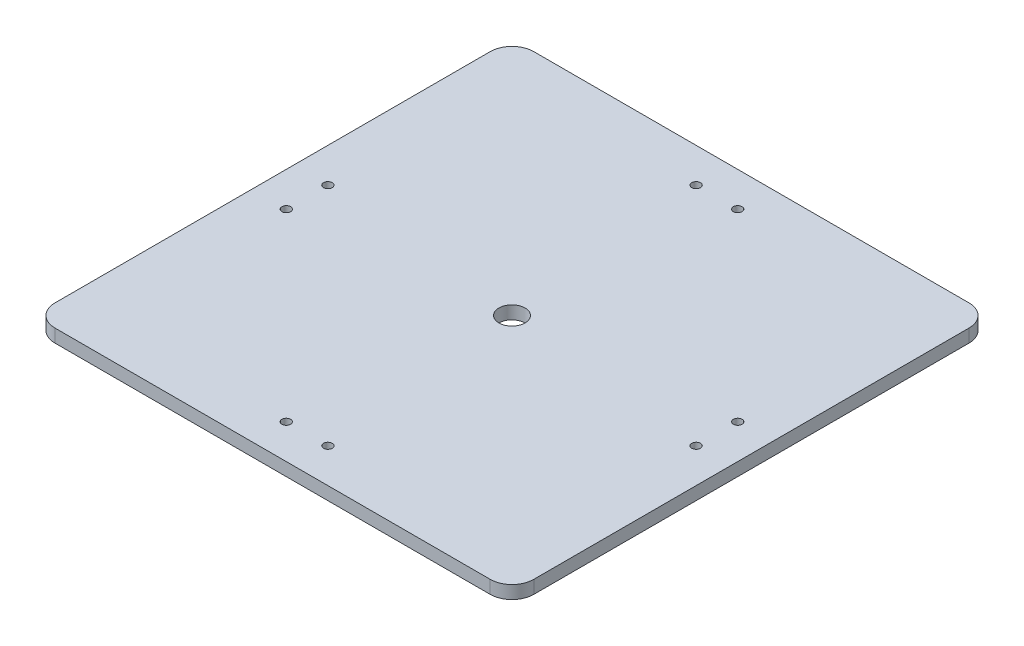
ISO-10303-21;
HEADER;
FILE_DESCRIPTION(('STEP AP214'),'2;1');
FILE_NAME('part.step','',(''),(''),'','','');
FILE_SCHEMA(('AUTOMOTIVE_DESIGN { 1 0 10303 214 1 1 1 1 }'));
ENDSEC;
DATA;
#1=APPLICATION_CONTEXT('core data for automotive mechanical design processes');
#2=APPLICATION_PROTOCOL_DEFINITION('international standard','automotive_design',2000,#1);
#3=PRODUCT_CONTEXT('',#1,'mechanical');
#4=PRODUCT('Part','Part','',(#3));
#5=PRODUCT_RELATED_PRODUCT_CATEGORY('part','',(#4));
#6=PRODUCT_DEFINITION_FORMATION('','',#4);
#7=PRODUCT_DEFINITION_CONTEXT('part definition',#1,'design');
#8=PRODUCT_DEFINITION('design','',#6,#7);
#9=PRODUCT_DEFINITION_SHAPE('','',#8);
#10=(LENGTH_UNIT() NAMED_UNIT(*) SI_UNIT(.MILLI.,.METRE.));
#11=(NAMED_UNIT(*) PLANE_ANGLE_UNIT() SI_UNIT($,.RADIAN.));
#12=(NAMED_UNIT(*) SI_UNIT($,.STERADIAN.) SOLID_ANGLE_UNIT());
#13=UNCERTAINTY_MEASURE_WITH_UNIT(LENGTH_MEASURE(1.E-05),#10,'distance_accuracy_value','');
#14=(GEOMETRIC_REPRESENTATION_CONTEXT(3) GLOBAL_UNCERTAINTY_ASSIGNED_CONTEXT((#13)) GLOBAL_UNIT_ASSIGNED_CONTEXT((#10,
#11,#12)) REPRESENTATION_CONTEXT('',''));
#15=CARTESIAN_POINT('',(0.,0.,0.));
#16=DIRECTION('',(0.,0.,1.));
#17=DIRECTION('',(1.,0.,0.));
#18=AXIS2_PLACEMENT_3D('',#15,#16,#17);
#19=CARTESIAN_POINT('',(-110.,6.,110.));
#20=DIRECTION('',(1.,0.,0.));
#21=DIRECTION('',(0.,0.,-1.));
#22=AXIS2_PLACEMENT_3D('',#19,#20,#21);
#23=PLANE('',#22);
#24=DIRECTION('',(0.,0.,1.));
#25=VECTOR('',#24,1.);
#26=CARTESIAN_POINT('',(-110.,6.,110.));
#27=LINE('',#26,#25);
#28=CARTESIAN_POINT('',(-110.,6.,-100.));
#29=VERTEX_POINT('',#28);
#30=CARTESIAN_POINT('',(-110.,6.,100.));
#31=VERTEX_POINT('',#30);
#32=EDGE_CURVE('E117',#29,#31,#27,.T.);
#33=ORIENTED_EDGE('',*,*,#32,.F.);
#34=DIRECTION('',(0.,-1.,0.));
#35=VECTOR('',#34,1.);
#36=CARTESIAN_POINT('',(-110.,6.,-100.));
#37=LINE('',#36,#35);
#38=CARTESIAN_POINT('',(-110.,0.,-100.));
#39=VERTEX_POINT('',#38);
#40=EDGE_CURVE('E102',#29,#39,#37,.T.);
#41=ORIENTED_EDGE('',*,*,#40,.T.);
#42=DIRECTION('',(0.,0.,1.));
#43=VECTOR('',#42,1.);
#44=CARTESIAN_POINT('',(-110.,0.,110.));
#45=LINE('',#44,#43);
#46=CARTESIAN_POINT('',(-110.,0.,100.));
#47=VERTEX_POINT('',#46);
#48=EDGE_CURVE('E114',#39,#47,#45,.T.);
#49=ORIENTED_EDGE('',*,*,#48,.T.);
#50=DIRECTION('',(0.,-1.,0.));
#51=VECTOR('',#50,1.);
#52=CARTESIAN_POINT('',(-110.,6.,100.));
#53=LINE('',#52,#51);
#54=EDGE_CURVE('E119',#47,#31,#53,.F.);
#55=ORIENTED_EDGE('',*,*,#54,.T.);
#56=EDGE_LOOP('',(#33,#41,#49,#55));
#57=FACE_BOUND('',#56,.T.);
#58=ADVANCED_FACE('F33',(#57),#23,.F.);
#59=CARTESIAN_POINT('',(110.,6.,110.));
#60=DIRECTION('',(0.,0.,-1.));
#61=DIRECTION('',(-1.,0.,0.));
#62=AXIS2_PLACEMENT_3D('',#59,#60,#61);
#63=PLANE('',#62);
#64=DIRECTION('',(1.,0.,0.));
#65=VECTOR('',#64,1.);
#66=CARTESIAN_POINT('',(110.,6.,110.));
#67=LINE('',#66,#65);
#68=CARTESIAN_POINT('',(-100.,6.,110.));
#69=VERTEX_POINT('',#68);
#70=CARTESIAN_POINT('',(100.,6.,110.));
#71=VERTEX_POINT('',#70);
#72=EDGE_CURVE('E172',#69,#71,#67,.T.);
#73=ORIENTED_EDGE('',*,*,#72,.F.);
#74=DIRECTION('',(0.,-1.,0.));
#75=VECTOR('',#74,1.);
#76=CARTESIAN_POINT('',(-100.,6.,110.));
#77=LINE('',#76,#75);
#78=CARTESIAN_POINT('',(-100.,0.,110.));
#79=VERTEX_POINT('',#78);
#80=EDGE_CURVE('E156',#69,#79,#77,.T.);
#81=ORIENTED_EDGE('',*,*,#80,.T.);
#82=DIRECTION('',(1.,0.,0.));
#83=VECTOR('',#82,1.);
#84=CARTESIAN_POINT('',(110.,0.,110.));
#85=LINE('',#84,#83);
#86=CARTESIAN_POINT('',(100.,0.,110.));
#87=VERTEX_POINT('',#86);
#88=EDGE_CURVE('E123',#79,#87,#85,.T.);
#89=ORIENTED_EDGE('',*,*,#88,.T.);
#90=DIRECTION('',(0.,-1.,0.));
#91=VECTOR('',#90,1.);
#92=CARTESIAN_POINT('',(100.,6.,110.));
#93=LINE('',#92,#91);
#94=EDGE_CURVE('E154',#87,#71,#93,.F.);
#95=ORIENTED_EDGE('',*,*,#94,.T.);
#96=EDGE_LOOP('',(#73,#81,#89,#95));
#97=FACE_BOUND('',#96,.T.);
#98=ADVANCED_FACE('F265',(#97),#63,.F.);
#99=CARTESIAN_POINT('',(110.,6.,110.));
#100=DIRECTION('',(-1.,0.,0.));
#101=DIRECTION('',(0.,0.,1.));
#102=AXIS2_PLACEMENT_3D('',#99,#100,#101);
#103=PLANE('',#102);
#104=DIRECTION('',(0.,0.,-1.));
#105=VECTOR('',#104,1.);
#106=CARTESIAN_POINT('',(110.,0.,110.));
#107=LINE('',#106,#105);
#108=CARTESIAN_POINT('',(110.,0.,100.));
#109=VERTEX_POINT('',#108);
#110=CARTESIAN_POINT('',(110.,0.,-100.));
#111=VERTEX_POINT('',#110);
#112=EDGE_CURVE('E127',#109,#111,#107,.T.);
#113=ORIENTED_EDGE('',*,*,#112,.T.);
#114=DIRECTION('',(0.,-1.,0.));
#115=VECTOR('',#114,1.);
#116=CARTESIAN_POINT('',(110.,6.,-100.));
#117=LINE('',#116,#115);
#118=CARTESIAN_POINT('',(110.,6.,-100.));
#119=VERTEX_POINT('',#118);
#120=EDGE_CURVE('E11',#111,#119,#117,.F.);
#121=ORIENTED_EDGE('',*,*,#120,.T.);
#122=DIRECTION('',(0.,0.,-1.));
#123=VECTOR('',#122,1.);
#124=CARTESIAN_POINT('',(110.,6.,110.));
#125=LINE('',#124,#123);
#126=CARTESIAN_POINT('',(110.,6.,100.));
#127=VERTEX_POINT('',#126);
#128=EDGE_CURVE('E162',#127,#119,#125,.T.);
#129=ORIENTED_EDGE('',*,*,#128,.F.);
#130=DIRECTION('',(0.,-1.,0.));
#131=VECTOR('',#130,1.);
#132=CARTESIAN_POINT('',(110.,6.,100.));
#133=LINE('',#132,#131);
#134=EDGE_CURVE('E41',#127,#109,#133,.T.);
#135=ORIENTED_EDGE('',*,*,#134,.T.);
#136=EDGE_LOOP('',(#113,#121,#129,#135));
#137=FACE_BOUND('',#136,.T.);
#138=ADVANCED_FACE('F161',(#137),#103,.F.);
#139=CARTESIAN_POINT('',(110.,6.,-110.));
#140=DIRECTION('',(0.,0.,1.));
#141=DIRECTION('',(1.,0.,0.));
#142=AXIS2_PLACEMENT_3D('',#139,#140,#141);
#143=PLANE('',#142);
#144=DIRECTION('',(-1.,0.,0.));
#145=VECTOR('',#144,1.);
#146=CARTESIAN_POINT('',(110.,0.,-110.));
#147=LINE('',#146,#145);
#148=CARTESIAN_POINT('',(100.,0.,-110.));
#149=VERTEX_POINT('',#148);
#150=CARTESIAN_POINT('',(-100.,0.,-110.));
#151=VERTEX_POINT('',#150);
#152=EDGE_CURVE('E137',#149,#151,#147,.T.);
#153=ORIENTED_EDGE('',*,*,#152,.T.);
#154=DIRECTION('',(0.,-1.,0.));
#155=VECTOR('',#154,1.);
#156=CARTESIAN_POINT('',(-100.,6.,-110.));
#157=LINE('',#156,#155);
#158=CARTESIAN_POINT('',(-100.,6.,-110.));
#159=VERTEX_POINT('',#158);
#160=EDGE_CURVE('E103',#151,#159,#157,.F.);
#161=ORIENTED_EDGE('',*,*,#160,.T.);
#162=DIRECTION('',(-1.,0.,0.));
#163=VECTOR('',#162,1.);
#164=CARTESIAN_POINT('',(110.,6.,-110.));
#165=LINE('',#164,#163);
#166=CARTESIAN_POINT('',(100.,6.,-110.));
#167=VERTEX_POINT('',#166);
#168=EDGE_CURVE('E133',#167,#159,#165,.T.);
#169=ORIENTED_EDGE('',*,*,#168,.F.);
#170=DIRECTION('',(0.,-1.,0.));
#171=VECTOR('',#170,1.);
#172=CARTESIAN_POINT('',(100.,6.,-110.));
#173=LINE('',#172,#171);
#174=EDGE_CURVE('E108',#167,#149,#173,.T.);
#175=ORIENTED_EDGE('',*,*,#174,.T.);
#176=EDGE_LOOP('',(#153,#161,#169,#175));
#177=FACE_BOUND('',#176,.T.);
#178=ADVANCED_FACE('F170',(#177),#143,.F.);
#179=CARTESIAN_POINT('',(0.,6.,0.));
#180=DIRECTION('',(0.,1.,0.));
#181=DIRECTION('',(0.,0.,1.));
#182=AXIS2_PLACEMENT_3D('',#179,#180,#181);
#183=PLANE('',#182);
#184=CARTESIAN_POINT('',(-9.557884959055,6.,94.1527377769062));
#185=DIRECTION('',(0.,1.,0.));
#186=DIRECTION('',(0.,0.,1.));
#187=AXIS2_PLACEMENT_3D('',#184,#185,#186);
#188=CIRCLE('',#187,2.);
#189=CARTESIAN_POINT('',(-9.557884959055,6.,96.1527377769062));
#190=VERTEX_POINT('',#189);
#191=EDGE_CURVE('E223',#190,#190,#188,.T.);
#192=ORIENTED_EDGE('',*,*,#191,.F.);
#193=EDGE_LOOP('',(#192));
#194=FACE_BOUND('',#193,.T.);
#195=CARTESIAN_POINT('',(9.5578849590553,6.,94.1527377769062));
#196=DIRECTION('',(0.,1.,0.));
#197=DIRECTION('',(0.,0.,1.));
#198=AXIS2_PLACEMENT_3D('',#195,#196,#197);
#199=CIRCLE('',#198,2.);
#200=CARTESIAN_POINT('',(9.5578849590553,6.,96.1527377769062));
#201=VERTEX_POINT('',#200);
#202=EDGE_CURVE('E217',#201,#201,#199,.T.);
#203=ORIENTED_EDGE('',*,*,#202,.F.);
#204=EDGE_LOOP('',(#203));
#205=FACE_BOUND('',#204,.T.);
#206=CARTESIAN_POINT('',(94.1527377769062,6.,9.55788495905531));
#207=DIRECTION('',(0.,1.,0.));
#208=DIRECTION('',(0.,0.,1.));
#209=AXIS2_PLACEMENT_3D('',#206,#207,#208);
#210=CIRCLE('',#209,2.);
#211=CARTESIAN_POINT('',(94.1527377769062,6.,11.5578849590553));
#212=VERTEX_POINT('',#211);
#213=EDGE_CURVE('E211',#212,#212,#210,.T.);
#214=ORIENTED_EDGE('',*,*,#213,.F.);
#215=EDGE_LOOP('',(#214));
#216=FACE_BOUND('',#215,.T.);
#217=CARTESIAN_POINT('',(94.1527377769062,6.,-9.55788495905629));
#218=DIRECTION('',(0.,1.,0.));
#219=DIRECTION('',(0.,0.,1.));
#220=AXIS2_PLACEMENT_3D('',#217,#218,#219);
#221=CIRCLE('',#220,2.);
#222=CARTESIAN_POINT('',(94.1527377769062,6.,-7.55788495905629));
#223=VERTEX_POINT('',#222);
#224=EDGE_CURVE('E205',#223,#223,#221,.T.);
#225=ORIENTED_EDGE('',*,*,#224,.F.);
#226=EDGE_LOOP('',(#225));
#227=FACE_BOUND('',#226,.T.);
#228=CARTESIAN_POINT('',(9.55788495905436,6.,-94.1527377769063));
#229=DIRECTION('',(0.,1.,0.));
#230=DIRECTION('',(0.,0.,1.));
#231=AXIS2_PLACEMENT_3D('',#228,#229,#230);
#232=CIRCLE('',#231,2.);
#233=CARTESIAN_POINT('',(9.55788495905436,6.,-92.1527377769063));
#234=VERTEX_POINT('',#233);
#235=EDGE_CURVE('E199',#234,#234,#232,.T.);
#236=ORIENTED_EDGE('',*,*,#235,.F.);
#237=EDGE_LOOP('',(#236));
#238=FACE_BOUND('',#237,.T.);
#239=CARTESIAN_POINT('',(-9.55788495905526,6.,-94.1527377769063));
#240=DIRECTION('',(0.,1.,0.));
#241=DIRECTION('',(0.,0.,1.));
#242=AXIS2_PLACEMENT_3D('',#239,#240,#241);
#243=CIRCLE('',#242,2.);
#244=CARTESIAN_POINT('',(-9.55788495905526,6.,-92.1527377769063));
#245=VERTEX_POINT('',#244);
#246=EDGE_CURVE('E193',#245,#245,#243,.T.);
#247=ORIENTED_EDGE('',*,*,#246,.F.);
#248=EDGE_LOOP('',(#247));
#249=FACE_BOUND('',#248,.T.);
#250=CARTESIAN_POINT('',(-94.1527377769062,6.,-9.55788495905534));
#251=DIRECTION('',(0.,1.,0.));
#252=DIRECTION('',(0.,0.,1.));
#253=AXIS2_PLACEMENT_3D('',#250,#251,#252);
#254=CIRCLE('',#253,2.);
#255=CARTESIAN_POINT('',(-94.1527377769062,6.,-7.55788495905534));
#256=VERTEX_POINT('',#255);
#257=EDGE_CURVE('E187',#256,#256,#254,.T.);
#258=ORIENTED_EDGE('',*,*,#257,.F.);
#259=EDGE_LOOP('',(#258));
#260=FACE_BOUND('',#259,.T.);
#261=CARTESIAN_POINT('',(-94.1527377769062,6.,9.55788495905561));
#262=DIRECTION('',(0.,1.,0.));
#263=DIRECTION('',(0.,0.,1.));
#264=AXIS2_PLACEMENT_3D('',#261,#262,#263);
#265=CIRCLE('',#264,2.);
#266=CARTESIAN_POINT('',(-94.1527377769062,6.,11.5578849590556));
#267=VERTEX_POINT('',#266);
#268=EDGE_CURVE('E181',#267,#267,#265,.T.);
#269=ORIENTED_EDGE('',*,*,#268,.F.);
#270=EDGE_LOOP('',(#269));
#271=FACE_BOUND('',#270,.T.);
#272=CARTESIAN_POINT('',(0.,6.,0.));
#273=DIRECTION('',(0.,1.,0.));
#274=DIRECTION('',(0.,0.,1.));
#275=AXIS2_PLACEMENT_3D('',#272,#273,#274);
#276=CIRCLE('',#275,6.);
#277=CARTESIAN_POINT('',(0.,6.,6.));
#278=VERTEX_POINT('',#277);
#279=EDGE_CURVE('E130',#278,#278,#276,.T.);
#280=ORIENTED_EDGE('',*,*,#279,.F.);
#281=EDGE_LOOP('',(#280));
#282=FACE_BOUND('',#281,.T.);
#283=ORIENTED_EDGE('',*,*,#168,.T.);
#284=CARTESIAN_POINT('',(-100.,6.,-100.));
#285=DIRECTION('',(0.,1.,0.));
#286=DIRECTION('',(0.,0.,1.));
#287=AXIS2_PLACEMENT_3D('',#284,#285,#286);
#288=CIRCLE('',#287,10.);
#289=EDGE_CURVE('E152',#159,#29,#288,.T.);
#290=ORIENTED_EDGE('',*,*,#289,.T.);
#291=ORIENTED_EDGE('',*,*,#32,.T.);
#292=CARTESIAN_POINT('',(-100.,6.,100.));
#293=DIRECTION('',(0.,1.,0.));
#294=DIRECTION('',(0.,0.,1.));
#295=AXIS2_PLACEMENT_3D('',#292,#293,#294);
#296=CIRCLE('',#295,10.);
#297=EDGE_CURVE('E150',#31,#69,#296,.T.);
#298=ORIENTED_EDGE('',*,*,#297,.T.);
#299=ORIENTED_EDGE('',*,*,#72,.T.);
#300=CARTESIAN_POINT('',(100.,6.,100.));
#301=DIRECTION('',(0.,1.,0.));
#302=DIRECTION('',(0.,0.,1.));
#303=AXIS2_PLACEMENT_3D('',#300,#301,#302);
#304=CIRCLE('',#303,10.);
#305=EDGE_CURVE('E53',#71,#127,#304,.T.);
#306=ORIENTED_EDGE('',*,*,#305,.T.);
#307=ORIENTED_EDGE('',*,*,#128,.T.);
#308=CARTESIAN_POINT('',(100.,6.,-100.));
#309=DIRECTION('',(0.,1.,0.));
#310=DIRECTION('',(0.,0.,1.));
#311=AXIS2_PLACEMENT_3D('',#308,#309,#310);
#312=CIRCLE('',#311,10.);
#313=EDGE_CURVE('E148',#119,#167,#312,.T.);
#314=ORIENTED_EDGE('',*,*,#313,.T.);
#315=EDGE_LOOP('',(#283,#290,#291,#298,#299,#306,#307,#314));
#316=FACE_BOUND('',#315,.T.);
#317=ADVANCED_FACE('F230',(#194,#205,#216,#227,#238,#249,#260,#271,#282,#316),#183,.T.);
#318=CARTESIAN_POINT('',(0.,0.,0.));
#319=DIRECTION('',(0.,1.,0.));
#320=DIRECTION('',(0.,0.,1.));
#321=AXIS2_PLACEMENT_3D('',#318,#319,#320);
#322=PLANE('',#321);
#323=CARTESIAN_POINT('',(-9.557884959055,0.,94.1527377769062));
#324=DIRECTION('',(0.,1.,0.));
#325=DIRECTION('',(0.,0.,1.));
#326=AXIS2_PLACEMENT_3D('',#323,#324,#325);
#327=CIRCLE('',#326,2.);
#328=CARTESIAN_POINT('',(-9.557884959055,0.,96.1527377769062));
#329=VERTEX_POINT('',#328);
#330=EDGE_CURVE('E220',#329,#329,#327,.T.);
#331=ORIENTED_EDGE('',*,*,#330,.T.);
#332=EDGE_LOOP('',(#331));
#333=FACE_BOUND('',#332,.T.);
#334=CARTESIAN_POINT('',(9.5578849590553,0.,94.1527377769062));
#335=DIRECTION('',(0.,1.,0.));
#336=DIRECTION('',(0.,0.,1.));
#337=AXIS2_PLACEMENT_3D('',#334,#335,#336);
#338=CIRCLE('',#337,1.99999999999999);
#339=CARTESIAN_POINT('',(9.5578849590553,0.,96.1527377769062));
#340=VERTEX_POINT('',#339);
#341=EDGE_CURVE('E214',#340,#340,#338,.T.);
#342=ORIENTED_EDGE('',*,*,#341,.T.);
#343=EDGE_LOOP('',(#342));
#344=FACE_BOUND('',#343,.T.);
#345=CARTESIAN_POINT('',(94.1527377769062,0.,9.55788495905531));
#346=DIRECTION('',(0.,1.,0.));
#347=DIRECTION('',(0.,0.,1.));
#348=AXIS2_PLACEMENT_3D('',#345,#346,#347);
#349=CIRCLE('',#348,1.99999999999999);
#350=CARTESIAN_POINT('',(94.1527377769062,0.,11.5578849590553));
#351=VERTEX_POINT('',#350);
#352=EDGE_CURVE('E208',#351,#351,#349,.T.);
#353=ORIENTED_EDGE('',*,*,#352,.T.);
#354=EDGE_LOOP('',(#353));
#355=FACE_BOUND('',#354,.T.);
#356=CARTESIAN_POINT('',(94.1527377769062,0.,-9.55788495905629));
#357=DIRECTION('',(0.,1.,0.));
#358=DIRECTION('',(0.,0.,1.));
#359=AXIS2_PLACEMENT_3D('',#356,#357,#358);
#360=CIRCLE('',#359,1.99999999999999);
#361=CARTESIAN_POINT('',(94.1527377769062,0.,-7.5578849590563));
#362=VERTEX_POINT('',#361);
#363=EDGE_CURVE('E202',#362,#362,#360,.T.);
#364=ORIENTED_EDGE('',*,*,#363,.T.);
#365=EDGE_LOOP('',(#364));
#366=FACE_BOUND('',#365,.T.);
#367=CARTESIAN_POINT('',(9.55788495905436,0.,-94.1527377769063));
#368=DIRECTION('',(0.,1.,0.));
#369=DIRECTION('',(0.,0.,1.));
#370=AXIS2_PLACEMENT_3D('',#367,#368,#369);
#371=CIRCLE('',#370,1.99999999999999);
#372=CARTESIAN_POINT('',(9.55788495905436,0.,-92.1527377769063));
#373=VERTEX_POINT('',#372);
#374=EDGE_CURVE('E196',#373,#373,#371,.T.);
#375=ORIENTED_EDGE('',*,*,#374,.T.);
#376=EDGE_LOOP('',(#375));
#377=FACE_BOUND('',#376,.T.);
#378=CARTESIAN_POINT('',(-9.55788495905526,0.,-94.1527377769063));
#379=DIRECTION('',(0.,1.,0.));
#380=DIRECTION('',(0.,0.,1.));
#381=AXIS2_PLACEMENT_3D('',#378,#379,#380);
#382=CIRCLE('',#381,2.);
#383=CARTESIAN_POINT('',(-9.55788495905526,0.,-92.1527377769063));
#384=VERTEX_POINT('',#383);
#385=EDGE_CURVE('E190',#384,#384,#382,.T.);
#386=ORIENTED_EDGE('',*,*,#385,.T.);
#387=EDGE_LOOP('',(#386));
#388=FACE_BOUND('',#387,.T.);
#389=CARTESIAN_POINT('',(-94.1527377769062,0.,-9.55788495905534));
#390=DIRECTION('',(0.,1.,0.));
#391=DIRECTION('',(0.,0.,1.));
#392=AXIS2_PLACEMENT_3D('',#389,#390,#391);
#393=CIRCLE('',#392,1.99999999999999);
#394=CARTESIAN_POINT('',(-94.1527377769062,0.,-7.55788495905534));
#395=VERTEX_POINT('',#394);
#396=EDGE_CURVE('E184',#395,#395,#393,.T.);
#397=ORIENTED_EDGE('',*,*,#396,.T.);
#398=EDGE_LOOP('',(#397));
#399=FACE_BOUND('',#398,.T.);
#400=CARTESIAN_POINT('',(-94.1527377769062,0.,9.55788495905561));
#401=DIRECTION('',(0.,1.,0.));
#402=DIRECTION('',(0.,0.,1.));
#403=AXIS2_PLACEMENT_3D('',#400,#401,#402);
#404=CIRCLE('',#403,1.99999999999999);
#405=CARTESIAN_POINT('',(-94.1527377769062,0.,11.5578849590556));
#406=VERTEX_POINT('',#405);
#407=EDGE_CURVE('E178',#406,#406,#404,.T.);
#408=ORIENTED_EDGE('',*,*,#407,.T.);
#409=EDGE_LOOP('',(#408));
#410=FACE_BOUND('',#409,.T.);
#411=CARTESIAN_POINT('',(0.,0.,0.));
#412=DIRECTION('',(0.,1.,0.));
#413=DIRECTION('',(0.,0.,1.));
#414=AXIS2_PLACEMENT_3D('',#411,#412,#413);
#415=CIRCLE('',#414,6.);
#416=CARTESIAN_POINT('',(0.,0.,6.));
#417=VERTEX_POINT('',#416);
#418=EDGE_CURVE('E124',#417,#417,#415,.T.);
#419=ORIENTED_EDGE('',*,*,#418,.T.);
#420=EDGE_LOOP('',(#419));
#421=FACE_BOUND('',#420,.T.);
#422=ORIENTED_EDGE('',*,*,#48,.F.);
#423=CARTESIAN_POINT('',(-100.,0.,-100.));
#424=DIRECTION('',(0.,1.,0.));
#425=DIRECTION('',(0.,0.,1.));
#426=AXIS2_PLACEMENT_3D('',#423,#424,#425);
#427=CIRCLE('',#426,10.);
#428=EDGE_CURVE('E98',#39,#151,#427,.F.);
#429=ORIENTED_EDGE('',*,*,#428,.T.);
#430=ORIENTED_EDGE('',*,*,#152,.F.);
#431=CARTESIAN_POINT('',(100.,0.,-100.));
#432=DIRECTION('',(0.,1.,0.));
#433=DIRECTION('',(0.,0.,1.));
#434=AXIS2_PLACEMENT_3D('',#431,#432,#433);
#435=CIRCLE('',#434,10.);
#436=EDGE_CURVE('E141',#149,#111,#435,.F.);
#437=ORIENTED_EDGE('',*,*,#436,.T.);
#438=ORIENTED_EDGE('',*,*,#112,.F.);
#439=CARTESIAN_POINT('',(100.,0.,100.));
#440=DIRECTION('',(0.,1.,0.));
#441=DIRECTION('',(0.,0.,1.));
#442=AXIS2_PLACEMENT_3D('',#439,#440,#441);
#443=CIRCLE('',#442,10.);
#444=EDGE_CURVE('E118',#109,#87,#443,.F.);
#445=ORIENTED_EDGE('',*,*,#444,.T.);
#446=ORIENTED_EDGE('',*,*,#88,.F.);
#447=CARTESIAN_POINT('',(-100.,0.,100.));
#448=DIRECTION('',(0.,1.,0.));
#449=DIRECTION('',(0.,0.,1.));
#450=AXIS2_PLACEMENT_3D('',#447,#448,#449);
#451=CIRCLE('',#450,10.);
#452=EDGE_CURVE('E109',#79,#47,#451,.F.);
#453=ORIENTED_EDGE('',*,*,#452,.T.);
#454=EDGE_LOOP('',(#422,#429,#430,#437,#438,#445,#446,#453));
#455=FACE_BOUND('',#454,.T.);
#456=ADVANCED_FACE('F121',(#333,#344,#355,#366,#377,#388,#399,#410,#421,#455),#322,.F.);
#457=CARTESIAN_POINT('',(0.,-45.,0.));
#458=DIRECTION('',(0.,1.,0.));
#459=DIRECTION('',(0.,0.,1.));
#460=AXIS2_PLACEMENT_3D('',#457,#458,#459);
#461=CYLINDRICAL_SURFACE('',#460,6.);
#462=ORIENTED_EDGE('',*,*,#279,.T.);
#463=EDGE_LOOP('',(#462));
#464=FACE_BOUND('',#463,.T.);
#465=ORIENTED_EDGE('',*,*,#418,.F.);
#466=EDGE_LOOP('',(#465));
#467=FACE_BOUND('',#466,.T.);
#468=ADVANCED_FACE('F250',(#464,#467),#461,.F.);
#469=CARTESIAN_POINT('',(-100.,6.,-100.));
#470=DIRECTION('',(0.,-1.,0.));
#471=DIRECTION('',(0.,0.,-1.));
#472=AXIS2_PLACEMENT_3D('',#469,#470,#471);
#473=CYLINDRICAL_SURFACE('',#472,10.);
#474=ORIENTED_EDGE('',*,*,#289,.F.);
#475=ORIENTED_EDGE('',*,*,#160,.F.);
#476=ORIENTED_EDGE('',*,*,#428,.F.);
#477=ORIENTED_EDGE('',*,*,#40,.F.);
#478=EDGE_LOOP('',(#474,#475,#476,#477));
#479=FACE_BOUND('',#478,.T.);
#480=ADVANCED_FACE('F101',(#479),#473,.T.);
#481=CARTESIAN_POINT('',(-100.,6.,100.));
#482=DIRECTION('',(0.,-1.,0.));
#483=DIRECTION('',(0.,0.,-1.));
#484=AXIS2_PLACEMENT_3D('',#481,#482,#483);
#485=CYLINDRICAL_SURFACE('',#484,10.);
#486=ORIENTED_EDGE('',*,*,#297,.F.);
#487=ORIENTED_EDGE('',*,*,#54,.F.);
#488=ORIENTED_EDGE('',*,*,#452,.F.);
#489=ORIENTED_EDGE('',*,*,#80,.F.);
#490=EDGE_LOOP('',(#486,#487,#488,#489));
#491=FACE_BOUND('',#490,.T.);
#492=ADVANCED_FACE('F277',(#491),#485,.T.);
#493=CARTESIAN_POINT('',(100.,6.,-100.));
#494=DIRECTION('',(0.,-1.,0.));
#495=DIRECTION('',(0.,0.,-1.));
#496=AXIS2_PLACEMENT_3D('',#493,#494,#495);
#497=CYLINDRICAL_SURFACE('',#496,10.);
#498=ORIENTED_EDGE('',*,*,#313,.F.);
#499=ORIENTED_EDGE('',*,*,#120,.F.);
#500=ORIENTED_EDGE('',*,*,#436,.F.);
#501=ORIENTED_EDGE('',*,*,#174,.F.);
#502=EDGE_LOOP('',(#498,#499,#500,#501));
#503=FACE_BOUND('',#502,.T.);
#504=ADVANCED_FACE('F167',(#503),#497,.T.);
#505=CARTESIAN_POINT('',(100.,6.,100.));
#506=DIRECTION('',(0.,-1.,0.));
#507=DIRECTION('',(0.,0.,-1.));
#508=AXIS2_PLACEMENT_3D('',#505,#506,#507);
#509=CYLINDRICAL_SURFACE('',#508,10.);
#510=ORIENTED_EDGE('',*,*,#305,.F.);
#511=ORIENTED_EDGE('',*,*,#94,.F.);
#512=ORIENTED_EDGE('',*,*,#444,.F.);
#513=ORIENTED_EDGE('',*,*,#134,.F.);
#514=EDGE_LOOP('',(#510,#511,#512,#513));
#515=FACE_BOUND('',#514,.T.);
#516=ADVANCED_FACE('F35',(#515),#509,.T.);
#517=CARTESIAN_POINT('',(-94.1527377769062,6.,9.55788495905561));
#518=DIRECTION('',(0.,1.,0.));
#519=DIRECTION('',(0.,0.,1.));
#520=AXIS2_PLACEMENT_3D('',#517,#518,#519);
#521=CYLINDRICAL_SURFACE('',#520,1.99999999999999);
#522=ORIENTED_EDGE('',*,*,#268,.T.);
#523=EDGE_LOOP('',(#522));
#524=FACE_BOUND('',#523,.T.);
#525=ORIENTED_EDGE('',*,*,#407,.F.);
#526=EDGE_LOOP('',(#525));
#527=FACE_BOUND('',#526,.T.);
#528=ADVANCED_FACE('F284',(#524,#527),#521,.F.);
#529=CARTESIAN_POINT('',(-94.1527377769062,6.,-9.55788495905534));
#530=DIRECTION('',(0.,1.,0.));
#531=DIRECTION('',(0.,0.,1.));
#532=AXIS2_PLACEMENT_3D('',#529,#530,#531);
#533=CYLINDRICAL_SURFACE('',#532,1.99999999999999);
#534=ORIENTED_EDGE('',*,*,#257,.T.);
#535=EDGE_LOOP('',(#534));
#536=FACE_BOUND('',#535,.T.);
#537=ORIENTED_EDGE('',*,*,#396,.F.);
#538=EDGE_LOOP('',(#537));
#539=FACE_BOUND('',#538,.T.);
#540=ADVANCED_FACE('F288',(#536,#539),#533,.F.);
#541=CARTESIAN_POINT('',(-9.55788495905526,6.,-94.1527377769063));
#542=DIRECTION('',(0.,1.,0.));
#543=DIRECTION('',(0.,0.,1.));
#544=AXIS2_PLACEMENT_3D('',#541,#542,#543);
#545=CYLINDRICAL_SURFACE('',#544,2.);
#546=ORIENTED_EDGE('',*,*,#246,.T.);
#547=EDGE_LOOP('',(#546));
#548=FACE_BOUND('',#547,.T.);
#549=ORIENTED_EDGE('',*,*,#385,.F.);
#550=EDGE_LOOP('',(#549));
#551=FACE_BOUND('',#550,.T.);
#552=ADVANCED_FACE('F297',(#548,#551),#545,.F.);
#553=CARTESIAN_POINT('',(9.55788495905436,6.,-94.1527377769063));
#554=DIRECTION('',(0.,1.,0.));
#555=DIRECTION('',(0.,0.,1.));
#556=AXIS2_PLACEMENT_3D('',#553,#554,#555);
#557=CYLINDRICAL_SURFACE('',#556,1.99999999999999);
#558=ORIENTED_EDGE('',*,*,#235,.T.);
#559=EDGE_LOOP('',(#558));
#560=FACE_BOUND('',#559,.T.);
#561=ORIENTED_EDGE('',*,*,#374,.F.);
#562=EDGE_LOOP('',(#561));
#563=FACE_BOUND('',#562,.T.);
#564=ADVANCED_FACE('F304',(#560,#563),#557,.F.);
#565=CARTESIAN_POINT('',(94.1527377769062,6.,-9.55788495905629));
#566=DIRECTION('',(0.,1.,0.));
#567=DIRECTION('',(0.,0.,1.));
#568=AXIS2_PLACEMENT_3D('',#565,#566,#567);
#569=CYLINDRICAL_SURFACE('',#568,1.99999999999999);
#570=ORIENTED_EDGE('',*,*,#224,.T.);
#571=EDGE_LOOP('',(#570));
#572=FACE_BOUND('',#571,.T.);
#573=ORIENTED_EDGE('',*,*,#363,.F.);
#574=EDGE_LOOP('',(#573));
#575=FACE_BOUND('',#574,.T.);
#576=ADVANCED_FACE('F308',(#572,#575),#569,.F.);
#577=CARTESIAN_POINT('',(94.1527377769062,6.,9.55788495905531));
#578=DIRECTION('',(0.,1.,0.));
#579=DIRECTION('',(0.,0.,1.));
#580=AXIS2_PLACEMENT_3D('',#577,#578,#579);
#581=CYLINDRICAL_SURFACE('',#580,1.99999999999999);
#582=ORIENTED_EDGE('',*,*,#213,.T.);
#583=EDGE_LOOP('',(#582));
#584=FACE_BOUND('',#583,.T.);
#585=ORIENTED_EDGE('',*,*,#352,.F.);
#586=EDGE_LOOP('',(#585));
#587=FACE_BOUND('',#586,.T.);
#588=ADVANCED_FACE('F312',(#584,#587),#581,.F.);
#589=CARTESIAN_POINT('',(9.5578849590553,6.,94.1527377769062));
#590=DIRECTION('',(0.,1.,0.));
#591=DIRECTION('',(0.,0.,1.));
#592=AXIS2_PLACEMENT_3D('',#589,#590,#591);
#593=CYLINDRICAL_SURFACE('',#592,1.99999999999999);
#594=ORIENTED_EDGE('',*,*,#202,.T.);
#595=EDGE_LOOP('',(#594));
#596=FACE_BOUND('',#595,.T.);
#597=ORIENTED_EDGE('',*,*,#341,.F.);
#598=EDGE_LOOP('',(#597));
#599=FACE_BOUND('',#598,.T.);
#600=ADVANCED_FACE('F316',(#596,#599),#593,.F.);
#601=CARTESIAN_POINT('',(-9.557884959055,6.,94.1527377769062));
#602=DIRECTION('',(0.,1.,0.));
#603=DIRECTION('',(0.,0.,1.));
#604=AXIS2_PLACEMENT_3D('',#601,#602,#603);
#605=CYLINDRICAL_SURFACE('',#604,2.);
#606=ORIENTED_EDGE('',*,*,#191,.T.);
#607=EDGE_LOOP('',(#606));
#608=FACE_BOUND('',#607,.T.);
#609=ORIENTED_EDGE('',*,*,#330,.F.);
#610=EDGE_LOOP('',(#609));
#611=FACE_BOUND('',#610,.T.);
#612=ADVANCED_FACE('F227',(#608,#611),#605,.F.);
#613=CLOSED_SHELL('',(#58,#98,#138,#178,#317,#456,#468,#480,#492,#504,#516,#528,#540,#552,#564,
#576,#588,#600,#612));
#614=MANIFOLD_SOLID_BREP('B2',#613);
#615=ADVANCED_BREP_SHAPE_REPRESENTATION('',(#18,#614),#14);
#616=SHAPE_DEFINITION_REPRESENTATION(#9,#615);
ENDSEC;
END-ISO-10303-21;
